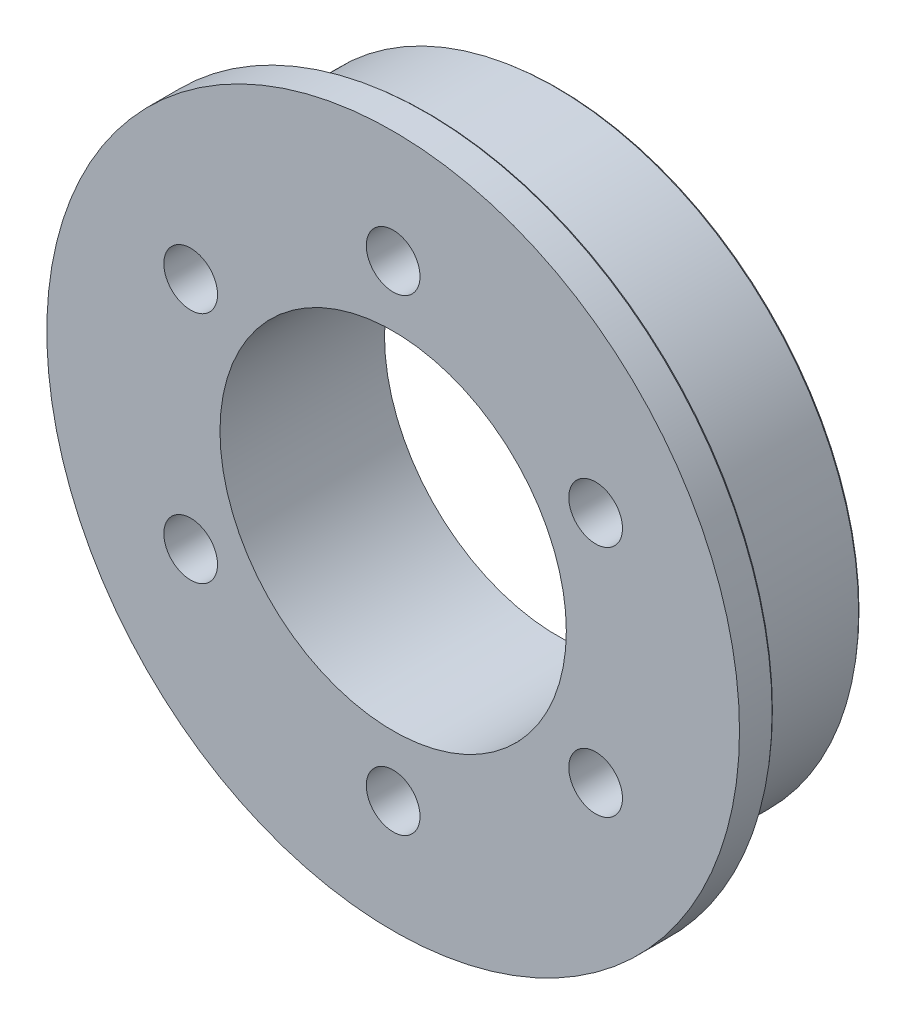
ISO-10303-21;
HEADER;
FILE_DESCRIPTION(('STEP AP214'),'2;1');
FILE_NAME('part.step','',(''),(''),'','','');
FILE_SCHEMA(('AUTOMOTIVE_DESIGN { 1 0 10303 214 1 1 1 1 }'));
ENDSEC;
DATA;
#1=APPLICATION_CONTEXT('core data for automotive mechanical design processes');
#2=APPLICATION_PROTOCOL_DEFINITION('international standard','automotive_design',2000,#1);
#3=PRODUCT_CONTEXT('',#1,'mechanical');
#4=PRODUCT('Part','Part','',(#3));
#5=PRODUCT_RELATED_PRODUCT_CATEGORY('part','',(#4));
#6=PRODUCT_DEFINITION_FORMATION('','',#4);
#7=PRODUCT_DEFINITION_CONTEXT('part definition',#1,'design');
#8=PRODUCT_DEFINITION('design','',#6,#7);
#9=PRODUCT_DEFINITION_SHAPE('','',#8);
#10=(LENGTH_UNIT() NAMED_UNIT(*) SI_UNIT(.MILLI.,.METRE.));
#11=(NAMED_UNIT(*) PLANE_ANGLE_UNIT() SI_UNIT($,.RADIAN.));
#12=(NAMED_UNIT(*) SI_UNIT($,.STERADIAN.) SOLID_ANGLE_UNIT());
#13=UNCERTAINTY_MEASURE_WITH_UNIT(LENGTH_MEASURE(1.E-05),#10,'distance_accuracy_value','');
#14=(GEOMETRIC_REPRESENTATION_CONTEXT(3) GLOBAL_UNCERTAINTY_ASSIGNED_CONTEXT((#13)) GLOBAL_UNIT_ASSIGNED_CONTEXT((#10,
#11,#12)) REPRESENTATION_CONTEXT('',''));
#15=CARTESIAN_POINT('',(0.,0.,0.));
#16=DIRECTION('',(0.,0.,1.));
#17=DIRECTION('',(1.,0.,0.));
#18=AXIS2_PLACEMENT_3D('',#15,#16,#17);
#19=CARTESIAN_POINT('',(0.,0.,0.));
#20=DIRECTION('',(0.,0.,1.));
#21=DIRECTION('',(1.,0.,0.));
#22=AXIS2_PLACEMENT_3D('',#19,#20,#21);
#23=PLANE('',#22);
#24=CARTESIAN_POINT('',(0.,0.,0.));
#25=DIRECTION('',(0.,0.,-1.));
#26=DIRECTION('',(-1.,0.,0.));
#27=AXIS2_PLACEMENT_3D('',#24,#25,#26);
#28=CIRCLE('',#27,10.);
#29=CARTESIAN_POINT('',(-10.,0.,0.));
#30=VERTEX_POINT('',#29);
#31=EDGE_CURVE('E96',#30,#30,#28,.T.);
#32=ORIENTED_EDGE('',*,*,#31,.F.);
#33=EDGE_LOOP('',(#32));
#34=FACE_BOUND('',#33,.T.);
#35=CARTESIAN_POINT('',(0.,0.,0.));
#36=DIRECTION('',(0.,0.,1.));
#37=DIRECTION('',(1.,0.,0.));
#38=AXIS2_PLACEMENT_3D('',#35,#36,#37);
#39=CIRCLE('',#38,17.4);
#40=CARTESIAN_POINT('',(17.4,0.,0.));
#41=VERTEX_POINT('',#40);
#42=EDGE_CURVE('E10',#41,#41,#39,.F.);
#43=ORIENTED_EDGE('',*,*,#42,.T.);
#44=EDGE_LOOP('',(#43));
#45=FACE_BOUND('',#44,.T.);
#46=CARTESIAN_POINT('',(0.,13.5,0.));
#47=DIRECTION('',(0.,0.,1.));
#48=DIRECTION('',(1.,0.,0.));
#49=AXIS2_PLACEMENT_3D('',#46,#47,#48);
#50=CIRCLE('',#49,1.55);
#51=CARTESIAN_POINT('',(1.55,13.5,0.));
#52=VERTEX_POINT('',#51);
#53=EDGE_CURVE('E57',#52,#52,#50,.T.);
#54=ORIENTED_EDGE('',*,*,#53,.T.);
#55=EDGE_LOOP('',(#54));
#56=FACE_BOUND('',#55,.T.);
#57=CARTESIAN_POINT('',(11.6913429510901,6.75000000000033,0.));
#58=DIRECTION('',(0.,0.,1.));
#59=DIRECTION('',(1.,0.,0.));
#60=AXIS2_PLACEMENT_3D('',#57,#58,#59);
#61=CIRCLE('',#60,1.55000000000012);
#62=CARTESIAN_POINT('',(13.2413429510902,6.75000000000033,0.));
#63=VERTEX_POINT('',#62);
#64=EDGE_CURVE('E60',#63,#63,#61,.T.);
#65=ORIENTED_EDGE('',*,*,#64,.T.);
#66=EDGE_LOOP('',(#65));
#67=FACE_BOUND('',#66,.T.);
#68=CARTESIAN_POINT('',(11.6913429510905,-6.74999999999967,0.));
#69=DIRECTION('',(0.,0.,1.));
#70=DIRECTION('',(1.,0.,0.));
#71=AXIS2_PLACEMENT_3D('',#68,#69,#70);
#72=CIRCLE('',#71,1.55000000000051);
#73=CARTESIAN_POINT('',(13.241342951091,-6.74999999999967,0.));
#74=VERTEX_POINT('',#73);
#75=EDGE_CURVE('E63',#74,#74,#72,.T.);
#76=ORIENTED_EDGE('',*,*,#75,.T.);
#77=EDGE_LOOP('',(#76));
#78=FACE_BOUND('',#77,.T.);
#79=CARTESIAN_POINT('',(7.62426335084362E-13,-13.5,0.));
#80=DIRECTION('',(0.,0.,1.));
#81=DIRECTION('',(1.,0.,0.));
#82=AXIS2_PLACEMENT_3D('',#79,#80,#81);
#83=CIRCLE('',#82,1.55000000000082);
#84=CARTESIAN_POINT('',(1.55000000000158,-13.5,0.));
#85=VERTEX_POINT('',#84);
#86=EDGE_CURVE('E66',#85,#85,#83,.T.);
#87=ORIENTED_EDGE('',*,*,#86,.T.);
#88=EDGE_LOOP('',(#87));
#89=FACE_BOUND('',#88,.T.);
#90=CARTESIAN_POINT('',(-11.6913429510893,-6.75000000000034,0.));
#91=DIRECTION('',(0.,0.,1.));
#92=DIRECTION('',(1.,0.,0.));
#93=AXIS2_PLACEMENT_3D('',#90,#91,#92);
#94=CIRCLE('',#93,1.55000000000077);
#95=CARTESIAN_POINT('',(-10.1413429510886,-6.75000000000034,0.));
#96=VERTEX_POINT('',#95);
#97=EDGE_CURVE('E69',#96,#96,#94,.T.);
#98=ORIENTED_EDGE('',*,*,#97,.T.);
#99=EDGE_LOOP('',(#98));
#100=FACE_BOUND('',#99,.T.);
#101=CARTESIAN_POINT('',(-11.6913429510897,6.74999999999966,0.));
#102=DIRECTION('',(0.,0.,1.));
#103=DIRECTION('',(1.,0.,0.));
#104=AXIS2_PLACEMENT_3D('',#101,#102,#103);
#105=CIRCLE('',#104,1.55000000000044);
#106=CARTESIAN_POINT('',(-10.1413429510893,6.74999999999966,0.));
#107=VERTEX_POINT('',#106);
#108=EDGE_CURVE('E72',#107,#107,#105,.T.);
#109=ORIENTED_EDGE('',*,*,#108,.T.);
#110=EDGE_LOOP('',(#109));
#111=FACE_BOUND('',#110,.T.);
#112=ADVANCED_FACE('F33',(#34,#45,#56,#67,#78,#89,#100,#111),#23,.F.);
#113=CARTESIAN_POINT('',(0.,0.,7.5));
#114=DIRECTION('',(0.,0.,-1.));
#115=DIRECTION('',(-1.,0.,0.));
#116=AXIS2_PLACEMENT_3D('',#113,#114,#115);
#117=CYLINDRICAL_SURFACE('',#116,17.5);
#118=CARTESIAN_POINT('',(0.,0.,0.119175359259427));
#119=DIRECTION('',(0.,0.,1.));
#120=DIRECTION('',(1.,0.,0.));
#121=AXIS2_PLACEMENT_3D('',#118,#119,#120);
#122=CIRCLE('',#121,17.5);
#123=CARTESIAN_POINT('',(17.5,0.,0.119175359259427));
#124=VERTEX_POINT('',#123);
#125=EDGE_CURVE('E42',#124,#124,#122,.T.);
#126=ORIENTED_EDGE('',*,*,#125,.T.);
#127=EDGE_LOOP('',(#126));
#128=FACE_BOUND('',#127,.T.);
#129=CARTESIAN_POINT('',(0.,0.,7.5));
#130=DIRECTION('',(0.,0.,1.));
#131=DIRECTION('',(1.,0.,0.));
#132=AXIS2_PLACEMENT_3D('',#129,#130,#131);
#133=CIRCLE('',#132,17.5);
#134=CARTESIAN_POINT('',(17.5,0.,7.5));
#135=VERTEX_POINT('',#134);
#136=EDGE_CURVE('E54',#135,#135,#133,.T.);
#137=ORIENTED_EDGE('',*,*,#136,.F.);
#138=EDGE_LOOP('',(#137));
#139=FACE_BOUND('',#138,.T.);
#140=ADVANCED_FACE('F128',(#128,#139),#117,.T.);
#141=CARTESIAN_POINT('',(0.,13.5,7.5));
#142=DIRECTION('',(0.,0.,-1.));
#143=DIRECTION('',(-1.,0.,0.));
#144=AXIS2_PLACEMENT_3D('',#141,#142,#143);
#145=CYLINDRICAL_SURFACE('',#144,1.55);
#146=ORIENTED_EDGE('',*,*,#53,.F.);
#147=EDGE_LOOP('',(#146));
#148=FACE_BOUND('',#147,.T.);
#149=CARTESIAN_POINT('',(0.,13.5,9.5));
#150=DIRECTION('',(0.,0.,1.));
#151=DIRECTION('',(1.,0.,0.));
#152=AXIS2_PLACEMENT_3D('',#149,#150,#151);
#153=CIRCLE('',#152,1.55);
#154=CARTESIAN_POINT('',(1.55,13.5,9.5));
#155=VERTEX_POINT('',#154);
#156=EDGE_CURVE('E93',#155,#155,#153,.T.);
#157=ORIENTED_EDGE('',*,*,#156,.T.);
#158=EDGE_LOOP('',(#157));
#159=FACE_BOUND('',#158,.T.);
#160=ADVANCED_FACE('F125',(#148,#159),#145,.F.);
#161=CARTESIAN_POINT('',(11.6913429510901,6.75000000000033,7.5));
#162=DIRECTION('',(0.,0.,-1.));
#163=DIRECTION('',(-1.,0.,0.));
#164=AXIS2_PLACEMENT_3D('',#161,#162,#163);
#165=CYLINDRICAL_SURFACE('',#164,1.55000000000012);
#166=ORIENTED_EDGE('',*,*,#64,.F.);
#167=EDGE_LOOP('',(#166));
#168=FACE_BOUND('',#167,.T.);
#169=CARTESIAN_POINT('',(11.6913429510901,6.75000000000033,9.5));
#170=DIRECTION('',(0.,0.,1.));
#171=DIRECTION('',(1.,0.,0.));
#172=AXIS2_PLACEMENT_3D('',#169,#170,#171);
#173=CIRCLE('',#172,1.55000000000012);
#174=CARTESIAN_POINT('',(13.2413429510902,6.75000000000033,9.5));
#175=VERTEX_POINT('',#174);
#176=EDGE_CURVE('E78',#175,#175,#173,.T.);
#177=ORIENTED_EDGE('',*,*,#176,.T.);
#178=EDGE_LOOP('',(#177));
#179=FACE_BOUND('',#178,.T.);
#180=ADVANCED_FACE('F127',(#168,#179),#165,.F.);
#181=CARTESIAN_POINT('',(11.6913429510905,-6.74999999999967,7.5));
#182=DIRECTION('',(0.,0.,-1.));
#183=DIRECTION('',(-1.,0.,0.));
#184=AXIS2_PLACEMENT_3D('',#181,#182,#183);
#185=CYLINDRICAL_SURFACE('',#184,1.55000000000051);
#186=ORIENTED_EDGE('',*,*,#75,.F.);
#187=EDGE_LOOP('',(#186));
#188=FACE_BOUND('',#187,.T.);
#189=CARTESIAN_POINT('',(11.6913429510905,-6.74999999999967,9.5));
#190=DIRECTION('',(0.,0.,1.));
#191=DIRECTION('',(1.,0.,0.));
#192=AXIS2_PLACEMENT_3D('',#189,#190,#191);
#193=CIRCLE('',#192,1.55000000000051);
#194=CARTESIAN_POINT('',(13.241342951091,-6.74999999999967,9.5));
#195=VERTEX_POINT('',#194);
#196=EDGE_CURVE('E81',#195,#195,#193,.T.);
#197=ORIENTED_EDGE('',*,*,#196,.T.);
#198=EDGE_LOOP('',(#197));
#199=FACE_BOUND('',#198,.T.);
#200=ADVANCED_FACE('F135',(#188,#199),#185,.F.);
#201=CARTESIAN_POINT('',(7.62426335084362E-13,-13.5,7.5));
#202=DIRECTION('',(0.,0.,-1.));
#203=DIRECTION('',(-1.,0.,0.));
#204=AXIS2_PLACEMENT_3D('',#201,#202,#203);
#205=CYLINDRICAL_SURFACE('',#204,1.55000000000082);
#206=ORIENTED_EDGE('',*,*,#86,.F.);
#207=EDGE_LOOP('',(#206));
#208=FACE_BOUND('',#207,.T.);
#209=CARTESIAN_POINT('',(7.62426335084362E-13,-13.5,9.5));
#210=DIRECTION('',(0.,0.,1.));
#211=DIRECTION('',(1.,0.,0.));
#212=AXIS2_PLACEMENT_3D('',#209,#210,#211);
#213=CIRCLE('',#212,1.55000000000082);
#214=CARTESIAN_POINT('',(1.55000000000158,-13.5,9.5));
#215=VERTEX_POINT('',#214);
#216=EDGE_CURVE('E84',#215,#215,#213,.T.);
#217=ORIENTED_EDGE('',*,*,#216,.T.);
#218=EDGE_LOOP('',(#217));
#219=FACE_BOUND('',#218,.T.);
#220=ADVANCED_FACE('F182',(#208,#219),#205,.F.);
#221=CARTESIAN_POINT('',(-11.6913429510893,-6.75000000000034,7.5));
#222=DIRECTION('',(0.,0.,-1.));
#223=DIRECTION('',(-1.,0.,0.));
#224=AXIS2_PLACEMENT_3D('',#221,#222,#223);
#225=CYLINDRICAL_SURFACE('',#224,1.55000000000077);
#226=ORIENTED_EDGE('',*,*,#97,.F.);
#227=EDGE_LOOP('',(#226));
#228=FACE_BOUND('',#227,.T.);
#229=CARTESIAN_POINT('',(-11.6913429510893,-6.75000000000034,9.5));
#230=DIRECTION('',(0.,0.,1.));
#231=DIRECTION('',(1.,0.,0.));
#232=AXIS2_PLACEMENT_3D('',#229,#230,#231);
#233=CIRCLE('',#232,1.55000000000077);
#234=CARTESIAN_POINT('',(-10.1413429510886,-6.75000000000034,9.5));
#235=VERTEX_POINT('',#234);
#236=EDGE_CURVE('E87',#235,#235,#233,.T.);
#237=ORIENTED_EDGE('',*,*,#236,.T.);
#238=EDGE_LOOP('',(#237));
#239=FACE_BOUND('',#238,.T.);
#240=ADVANCED_FACE('F178',(#228,#239),#225,.F.);
#241=CARTESIAN_POINT('',(-11.6913429510897,6.74999999999966,7.5));
#242=DIRECTION('',(0.,0.,-1.));
#243=DIRECTION('',(-1.,0.,0.));
#244=AXIS2_PLACEMENT_3D('',#241,#242,#243);
#245=CYLINDRICAL_SURFACE('',#244,1.55000000000044);
#246=ORIENTED_EDGE('',*,*,#108,.F.);
#247=EDGE_LOOP('',(#246));
#248=FACE_BOUND('',#247,.T.);
#249=CARTESIAN_POINT('',(-11.6913429510897,6.74999999999966,9.5));
#250=DIRECTION('',(0.,0.,1.));
#251=DIRECTION('',(1.,0.,0.));
#252=AXIS2_PLACEMENT_3D('',#249,#250,#251);
#253=CIRCLE('',#252,1.55000000000044);
#254=CARTESIAN_POINT('',(-10.1413429510893,6.74999999999966,9.5));
#255=VERTEX_POINT('',#254);
#256=EDGE_CURVE('E90',#255,#255,#253,.T.);
#257=ORIENTED_EDGE('',*,*,#256,.T.);
#258=EDGE_LOOP('',(#257));
#259=FACE_BOUND('',#258,.T.);
#260=ADVANCED_FACE('F109',(#248,#259),#245,.F.);
#261=CARTESIAN_POINT('',(0.,0.,9.5));
#262=DIRECTION('',(0.,0.,1.));
#263=DIRECTION('',(1.,0.,0.));
#264=AXIS2_PLACEMENT_3D('',#261,#262,#263);
#265=PLANE('',#264);
#266=CARTESIAN_POINT('',(0.,0.,9.5));
#267=DIRECTION('',(0.,0.,1.));
#268=DIRECTION('',(1.,0.,0.));
#269=AXIS2_PLACEMENT_3D('',#266,#267,#268);
#270=CIRCLE('',#269,10.);
#271=CARTESIAN_POINT('',(10.,0.,9.5));
#272=VERTEX_POINT('',#271);
#273=EDGE_CURVE('E38',#272,#272,#270,.T.);
#274=ORIENTED_EDGE('',*,*,#273,.F.);
#275=EDGE_LOOP('',(#274));
#276=FACE_BOUND('',#275,.T.);
#277=ORIENTED_EDGE('',*,*,#256,.F.);
#278=EDGE_LOOP('',(#277));
#279=FACE_BOUND('',#278,.T.);
#280=ORIENTED_EDGE('',*,*,#216,.F.);
#281=EDGE_LOOP('',(#280));
#282=FACE_BOUND('',#281,.T.);
#283=ORIENTED_EDGE('',*,*,#176,.F.);
#284=EDGE_LOOP('',(#283));
#285=FACE_BOUND('',#284,.T.);
#286=CARTESIAN_POINT('',(0.,0.,9.5));
#287=DIRECTION('',(0.,0.,1.));
#288=DIRECTION('',(1.,0.,0.));
#289=AXIS2_PLACEMENT_3D('',#286,#287,#288);
#290=CIRCLE('',#289,20.);
#291=CARTESIAN_POINT('',(20.,0.,9.5));
#292=VERTEX_POINT('',#291);
#293=EDGE_CURVE('E75',#292,#292,#290,.T.);
#294=ORIENTED_EDGE('',*,*,#293,.T.);
#295=EDGE_LOOP('',(#294));
#296=FACE_BOUND('',#295,.T.);
#297=ORIENTED_EDGE('',*,*,#196,.F.);
#298=EDGE_LOOP('',(#297));
#299=FACE_BOUND('',#298,.T.);
#300=ORIENTED_EDGE('',*,*,#236,.F.);
#301=EDGE_LOOP('',(#300));
#302=FACE_BOUND('',#301,.T.);
#303=ORIENTED_EDGE('',*,*,#156,.F.);
#304=EDGE_LOOP('',(#303));
#305=FACE_BOUND('',#304,.T.);
#306=ADVANCED_FACE('F105',(#276,#279,#282,#285,#296,#299,#302,#305),#265,.T.);
#307=CARTESIAN_POINT('',(0.,0.,7.5));
#308=DIRECTION('',(0.,0.,1.));
#309=DIRECTION('',(1.,0.,0.));
#310=AXIS2_PLACEMENT_3D('',#307,#308,#309);
#311=PLANE('',#310);
#312=CARTESIAN_POINT('',(0.,0.,7.5));
#313=DIRECTION('',(0.,0.,1.));
#314=DIRECTION('',(1.,0.,0.));
#315=AXIS2_PLACEMENT_3D('',#312,#313,#314);
#316=CIRCLE('',#315,19.9);
#317=CARTESIAN_POINT('',(19.9,0.,7.5));
#318=VERTEX_POINT('',#317);
#319=EDGE_CURVE('E46',#318,#318,#316,.F.);
#320=ORIENTED_EDGE('',*,*,#319,.T.);
#321=EDGE_LOOP('',(#320));
#322=FACE_BOUND('',#321,.T.);
#323=ORIENTED_EDGE('',*,*,#136,.T.);
#324=EDGE_LOOP('',(#323));
#325=FACE_BOUND('',#324,.T.);
#326=ADVANCED_FACE('F108',(#322,#325),#311,.F.);
#327=CARTESIAN_POINT('',(0.,0.,9.5));
#328=DIRECTION('',(0.,0.,-1.));
#329=DIRECTION('',(-1.,0.,0.));
#330=AXIS2_PLACEMENT_3D('',#327,#328,#329);
#331=CYLINDRICAL_SURFACE('',#330,20.);
#332=CARTESIAN_POINT('',(0.,0.,7.61917535925942));
#333=DIRECTION('',(0.,0.,1.));
#334=DIRECTION('',(1.,0.,0.));
#335=AXIS2_PLACEMENT_3D('',#332,#333,#334);
#336=CIRCLE('',#335,20.);
#337=CARTESIAN_POINT('',(20.,0.,7.61917535925942));
#338=VERTEX_POINT('',#337);
#339=EDGE_CURVE('E51',#338,#338,#336,.T.);
#340=ORIENTED_EDGE('',*,*,#339,.T.);
#341=EDGE_LOOP('',(#340));
#342=FACE_BOUND('',#341,.T.);
#343=ORIENTED_EDGE('',*,*,#293,.F.);
#344=EDGE_LOOP('',(#343));
#345=FACE_BOUND('',#344,.T.);
#346=ADVANCED_FACE('F152',(#342,#345),#331,.T.);
#347=CARTESIAN_POINT('',(0.,0.,7.61917535925942));
#348=DIRECTION('',(0.,0.,1.));
#349=DIRECTION('',(1.,0.,0.));
#350=AXIS2_PLACEMENT_3D('',#347,#348,#349);
#351=CONICAL_SURFACE('',#350,20.,0.69813170079775);
#352=ORIENTED_EDGE('',*,*,#319,.F.);
#353=EDGE_LOOP('',(#352));
#354=FACE_BOUND('',#353,.T.);
#355=ORIENTED_EDGE('',*,*,#339,.F.);
#356=EDGE_LOOP('',(#355));
#357=FACE_BOUND('',#356,.T.);
#358=ADVANCED_FACE('F148',(#354,#357),#351,.T.);
#359=CARTESIAN_POINT('',(0.,0.,0.119175359259427));
#360=DIRECTION('',(0.,0.,1.));
#361=DIRECTION('',(1.,0.,0.));
#362=AXIS2_PLACEMENT_3D('',#359,#360,#361);
#363=CONICAL_SURFACE('',#362,17.5,0.698131700797722);
#364=ORIENTED_EDGE('',*,*,#42,.F.);
#365=EDGE_LOOP('',(#364));
#366=FACE_BOUND('',#365,.T.);
#367=ORIENTED_EDGE('',*,*,#125,.F.);
#368=EDGE_LOOP('',(#367));
#369=FACE_BOUND('',#368,.T.);
#370=ADVANCED_FACE('F36',(#366,#369),#363,.T.);
#371=CARTESIAN_POINT('',(0.,0.,25.));
#372=DIRECTION('',(0.,0.,-1.));
#373=DIRECTION('',(-1.,0.,0.));
#374=AXIS2_PLACEMENT_3D('',#371,#372,#373);
#375=CYLINDRICAL_SURFACE('',#374,10.);
#376=ORIENTED_EDGE('',*,*,#273,.T.);
#377=EDGE_LOOP('',(#376));
#378=FACE_BOUND('',#377,.T.);
#379=ORIENTED_EDGE('',*,*,#31,.T.);
#380=EDGE_LOOP('',(#379));
#381=FACE_BOUND('',#380,.T.);
#382=ADVANCED_FACE('F103',(#378,#381),#375,.F.);
#383=CLOSED_SHELL('',(#112,#140,#160,#180,#200,#220,#240,#260,#306,#326,#346,#358,#370,#382));
#384=MANIFOLD_SOLID_BREP('B2',#383);
#385=ADVANCED_BREP_SHAPE_REPRESENTATION('',(#18,#384),#14);
#386=SHAPE_DEFINITION_REPRESENTATION(#9,#385);
ENDSEC;
END-ISO-10303-21;
